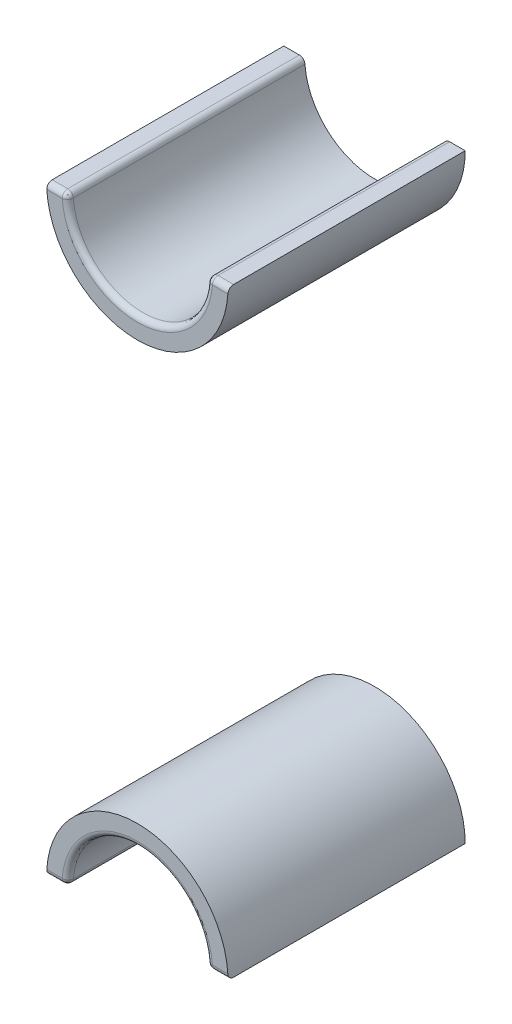
ISO-10303-21;
HEADER;
FILE_DESCRIPTION(('STEP AP214'),'2;1');
FILE_NAME('part.step','',(''),(''),'','','');
FILE_SCHEMA(('AUTOMOTIVE_DESIGN { 1 0 10303 214 1 1 1 1 }'));
ENDSEC;
DATA;
#1=APPLICATION_CONTEXT('core data for automotive mechanical design processes');
#2=APPLICATION_PROTOCOL_DEFINITION('international standard','automotive_design',2000,#1);
#3=PRODUCT_CONTEXT('',#1,'mechanical');
#4=PRODUCT('Part','Part','',(#3));
#5=PRODUCT_RELATED_PRODUCT_CATEGORY('part','',(#4));
#6=PRODUCT_DEFINITION_FORMATION('','',#4);
#7=PRODUCT_DEFINITION_CONTEXT('part definition',#1,'design');
#8=PRODUCT_DEFINITION('design','',#6,#7);
#9=PRODUCT_DEFINITION_SHAPE('','',#8);
#10=(LENGTH_UNIT() NAMED_UNIT(*) SI_UNIT(.MILLI.,.METRE.));
#11=(NAMED_UNIT(*) PLANE_ANGLE_UNIT() SI_UNIT($,.RADIAN.));
#12=(NAMED_UNIT(*) SI_UNIT($,.STERADIAN.) SOLID_ANGLE_UNIT());
#13=UNCERTAINTY_MEASURE_WITH_UNIT(LENGTH_MEASURE(1.E-05),#10,'distance_accuracy_value','');
#14=(GEOMETRIC_REPRESENTATION_CONTEXT(3) GLOBAL_UNCERTAINTY_ASSIGNED_CONTEXT((#13)) GLOBAL_UNIT_ASSIGNED_CONTEXT((#10,
#11,#12)) REPRESENTATION_CONTEXT('',''));
#15=CARTESIAN_POINT('',(0.,0.,0.));
#16=DIRECTION('',(0.,0.,1.));
#17=DIRECTION('',(1.,0.,0.));
#18=AXIS2_PLACEMENT_3D('',#15,#16,#17);
#19=CARTESIAN_POINT('',(-13.76925888777,-7.555000663211,0.83));
#20=DIRECTION('',(0.562053509505717,-0.605350141346696,0.563601861976912));
#21=DIRECTION('',(-0.73282810067942,-0.6804138261783,0.));
#22=AXIS2_PLACEMENT_3D('',#19,#20,#21);
#23=SPHERICAL_SURFACE('',#22,0.02);
#24=CARTESIAN_POINT('',(-13.7580178175799,-7.56710766603793,0.841272037239538));
#25=VERTEX_POINT('',#24);
#26=VERTEX_LOOP('',#25);
#27=FACE_BOUND('',#26,.T.);
#28=CARTESIAN_POINT('',(-13.7692588877685,-7.55500066321122,0.83));
#29=DIRECTION('',(1.,1.19248806385E-08,0.));
#30=DIRECTION('',(-1.19248806385E-08,1.,0.));
#31=AXIS2_PLACEMENT_3D('',#28,#29,#30);
#32=CIRCLE('',#31,0.02);
#33=CARTESIAN_POINT('',(-13.7692588875308,-7.57500066321085,0.83));
#34=VERTEX_POINT('',#33);
#35=CARTESIAN_POINT('',(-13.7692588877715,-7.55500066321087,0.85));
#36=VERTEX_POINT('',#35);
#37=EDGE_CURVE('P0_E95',#34,#36,#32,.F.);
#38=ORIENTED_EDGE('',*,*,#37,.F.);
#39=CARTESIAN_POINT('',(-13.76925888777,-7.555000663211,0.83));
#40=DIRECTION('',(0.,0.,1.));
#41=DIRECTION('',(1.,0.,0.));
#42=AXIS2_PLACEMENT_3D('',#39,#40,#41);
#43=CIRCLE('',#42,0.02);
#44=CARTESIAN_POINT('',(-13.7493138329137,-7.55648214445459,0.83));
#45=VERTEX_POINT('',#44);
#46=EDGE_CURVE('P0_E97',#45,#34,#43,.F.);
#47=ORIENTED_EDGE('',*,*,#46,.F.);
#48=CARTESIAN_POINT('',(-13.7692588877752,-7.55500066321061,0.83));
#49=DIRECTION('',(0.0740740621829114,0.997252742945199,0.));
#50=DIRECTION('',(-0.997252742945202,0.0740740621828693,0.));
#51=AXIS2_PLACEMENT_3D('',#48,#49,#50);
#52=CIRCLE('',#51,0.02);
#53=EDGE_CURVE('P0_E92',#36,#45,#52,.T.);
#54=ORIENTED_EDGE('',*,*,#53,.F.);
#55=EDGE_LOOP('',(#38,#47,#54));
#56=FACE_BOUND('',#55,.T.);
#57=ADVANCED_FACE('P0_F17',(#27,#56),#23,.T.);
#58=CARTESIAN_POINT('',(-13.50000064718,-7.57500066,0.83));
#59=DIRECTION('',(0.,0.,-1.));
#60=DIRECTION('',(-1.19248810928721E-08,1.,0.));
#61=AXIS2_PLACEMENT_3D('',#58,#59,#60);
#62=TOROIDAL_SURFACE('',#61,0.27,0.02);
#63=CARTESIAN_POINT('',(-13.2307424070618,-7.55500065678907,0.83));
#64=DIRECTION('',(0.0740740859664174,-0.997252741178604,0.));
#65=DIRECTION('',(0.997252741178601,0.0740740859664595,0.));
#66=AXIS2_PLACEMENT_3D('',#63,#64,#65);
#67=CIRCLE('',#66,0.02);
#68=CARTESIAN_POINT('',(-13.2307424070603,-7.55500065678911,0.85));
#69=VERTEX_POINT('',#68);
#70=CARTESIAN_POINT('',(-13.2506874618845,-7.55648213850833,0.83));
#71=VERTEX_POINT('',#70);
#72=EDGE_CURVE('P0_E99',#69,#71,#67,.T.);
#73=ORIENTED_EDGE('',*,*,#72,.F.);
#74=CARTESIAN_POINT('',(-13.50000064718,-7.57500066,0.85));
#75=DIRECTION('',(0.,0.,1.));
#76=DIRECTION('',(0.997252741178604,0.0740740859664134,0.));
#77=AXIS2_PLACEMENT_3D('',#74,#75,#76);
#78=CIRCLE('',#77,0.270000000000889);
#79=EDGE_CURVE('P0_E101',#36,#69,#78,.F.);
#80=ORIENTED_EDGE('',*,*,#79,.F.);
#81=ORIENTED_EDGE('',*,*,#53,.T.);
#82=CARTESIAN_POINT('',(-13.50000064718,-7.57500066,0.83));
#83=DIRECTION('',(0.,0.,-1.));
#84=DIRECTION('',(-1.,0.,0.));
#85=AXIS2_PLACEMENT_3D('',#82,#83,#84);
#86=CIRCLE('',#85,0.25);
#87=EDGE_CURVE('P0_E79',#45,#71,#86,.T.);
#88=ORIENTED_EDGE('',*,*,#87,.T.);
#89=EDGE_LOOP('',(#73,#80,#81,#88));
#90=FACE_BOUND('',#89,.T.);
#91=ADVANCED_FACE('P0_F103',(#90),#62,.T.);
#92=CARTESIAN_POINT('',(-13.23074240706,-7.555000656789,0.83));
#93=DIRECTION('',(-0.562053495069257,-0.605350154751276,0.5636018619762));
#94=DIRECTION('',(-0.732828116906504,0.680413808701196,-2.62206922840846E-13));
#95=AXIS2_PLACEMENT_3D('',#92,#93,#94);
#96=SPHERICAL_SURFACE('',#95,0.02);
#97=CARTESIAN_POINT('',(-13.2419834769614,-7.56710765988403,0.841272037239524));
#98=VERTEX_POINT('',#97);
#99=VERTEX_LOOP('',#98);
#100=FACE_BOUND('',#99,.T.);
#101=CARTESIAN_POINT('',(-13.23074240706,-7.55500065678948,0.83));
#102=DIRECTION('',(1.,1.19248806385E-08,0.));
#103=DIRECTION('',(-1.19248806385E-08,1.,0.));
#104=AXIS2_PLACEMENT_3D('',#101,#102,#103);
#105=CIRCLE('',#104,0.02);
#106=CARTESIAN_POINT('',(-13.2307424068208,-7.57500065678904,0.83));
#107=VERTEX_POINT('',#106);
#108=EDGE_CURVE('P0_E124',#69,#107,#105,.T.);
#109=ORIENTED_EDGE('',*,*,#108,.F.);
#110=ORIENTED_EDGE('',*,*,#72,.T.);
#111=CARTESIAN_POINT('',(-13.23074240706,-7.555000656789,0.83));
#112=DIRECTION('',(0.,0.,-1.));
#113=DIRECTION('',(-1.,0.,0.));
#114=AXIS2_PLACEMENT_3D('',#111,#112,#113);
#115=CIRCLE('',#114,0.02);
#116=EDGE_CURVE('P0_E148',#107,#71,#115,.T.);
#117=ORIENTED_EDGE('',*,*,#116,.F.);
#118=EDGE_LOOP('',(#109,#110,#117));
#119=FACE_BOUND('',#118,.T.);
#120=ADVANCED_FACE('P0_F152',(#100,#119),#96,.T.);
#121=CARTESIAN_POINT('',(-13.50000064718,-7.57500066,0.));
#122=DIRECTION('',(0.,0.,-1.));
#123=DIRECTION('',(-1.,0.,0.));
#124=AXIS2_PLACEMENT_3D('',#121,#122,#123);
#125=CYLINDRICAL_SURFACE('',#124,0.25);
#126=CARTESIAN_POINT('',(-13.50000064718,-7.57500066,0.));
#127=DIRECTION('',(0.,0.,-1.));
#128=DIRECTION('',(-1.,0.,0.));
#129=AXIS2_PLACEMENT_3D('',#126,#127,#128);
#130=CIRCLE('',#129,0.25);
#131=CARTESIAN_POINT('',(-13.7493138329113,-7.55648214445477,0.));
#132=VERTEX_POINT('',#131);
#133=CARTESIAN_POINT('',(-13.2506874618836,-7.5564821385083,0.));
#134=VERTEX_POINT('',#133);
#135=EDGE_CURVE('P0_E210',#132,#134,#130,.T.);
#136=ORIENTED_EDGE('',*,*,#135,.T.);
#137=DIRECTION('',(0.,0.,-1.));
#138=VECTOR('',#137,1.);
#139=CARTESIAN_POINT('',(-13.2506874618836,-7.55648213850827,0.));
#140=LINE('',#139,#138);
#141=EDGE_CURVE('P0_E141',#71,#134,#140,.T.);
#142=ORIENTED_EDGE('',*,*,#141,.F.);
#143=ORIENTED_EDGE('',*,*,#87,.F.);
#144=DIRECTION('',(0.,0.,1.));
#145=VECTOR('',#144,1.);
#146=CARTESIAN_POINT('',(-13.7493138329111,-7.55648214445492,0.));
#147=LINE('',#146,#145);
#148=EDGE_CURVE('P0_E139',#132,#45,#147,.T.);
#149=ORIENTED_EDGE('',*,*,#148,.F.);
#150=EDGE_LOOP('',(#136,#142,#143,#149));
#151=FACE_BOUND('',#150,.T.);
#152=ADVANCED_FACE('P0_F155',(#151),#125,.F.);
#153=CARTESIAN_POINT('',(-13.23074240706,-7.555000656789,0.));
#154=DIRECTION('',(0.,0.,-1.));
#155=DIRECTION('',(-1.,0.,0.));
#156=AXIS2_PLACEMENT_3D('',#153,#154,#155);
#157=CYLINDRICAL_SURFACE('',#156,0.02);
#158=ORIENTED_EDGE('',*,*,#116,.T.);
#159=ORIENTED_EDGE('',*,*,#141,.T.);
#160=CARTESIAN_POINT('',(-13.23074240706,-7.555000656789,0.));
#161=DIRECTION('',(0.,0.,-1.));
#162=DIRECTION('',(-1.,0.,0.));
#163=AXIS2_PLACEMENT_3D('',#160,#161,#162);
#164=CIRCLE('',#163,0.02);
#165=CARTESIAN_POINT('',(-13.23074240694,-7.57500065678892,0.));
#166=VERTEX_POINT('',#165);
#167=EDGE_CURVE('P0_E208',#134,#166,#164,.F.);
#168=ORIENTED_EDGE('',*,*,#167,.T.);
#169=DIRECTION('',(0.,0.,1.));
#170=VECTOR('',#169,1.);
#171=CARTESIAN_POINT('',(-13.23074240682,-7.57500065678883,0.));
#172=LINE('',#171,#170);
#173=EDGE_CURVE('P0_E142',#107,#166,#172,.F.);
#174=ORIENTED_EDGE('',*,*,#173,.F.);
#175=EDGE_LOOP('',(#158,#159,#168,#174));
#176=FACE_BOUND('',#175,.T.);
#177=ADVANCED_FACE('P0_F228',(#176),#157,.T.);
#178=CARTESIAN_POINT('',(-13.76925888777,-7.555000663211,0.));
#179=DIRECTION('',(0.,0.,1.));
#180=DIRECTION('',(1.,0.,0.));
#181=AXIS2_PLACEMENT_3D('',#178,#179,#180);
#182=CYLINDRICAL_SURFACE('',#181,0.02);
#183=ORIENTED_EDGE('',*,*,#46,.T.);
#184=DIRECTION('',(0.,0.,1.));
#185=VECTOR('',#184,1.);
#186=CARTESIAN_POINT('',(-13.76925888753,-7.57500066321058,0.));
#187=LINE('',#186,#185);
#188=CARTESIAN_POINT('',(-13.7692588875308,-7.57500066321058,0.));
#189=VERTEX_POINT('',#188);
#190=EDGE_CURVE('P0_E136',#189,#34,#187,.T.);
#191=ORIENTED_EDGE('',*,*,#190,.F.);
#192=CARTESIAN_POINT('',(-13.76925888777,-7.555000663211,0.));
#193=DIRECTION('',(0.,0.,1.));
#194=DIRECTION('',(1.,0.,0.));
#195=AXIS2_PLACEMENT_3D('',#192,#193,#194);
#196=CIRCLE('',#195,0.02);
#197=EDGE_CURVE('P0_E138',#189,#132,#196,.T.);
#198=ORIENTED_EDGE('',*,*,#197,.T.);
#199=ORIENTED_EDGE('',*,*,#148,.T.);
#200=EDGE_LOOP('',(#183,#191,#198,#199));
#201=FACE_BOUND('',#200,.T.);
#202=ADVANCED_FACE('P0_F198',(#201),#182,.T.);
#203=CARTESIAN_POINT('',(-13.83750064741,-7.555000664025,0.83));
#204=DIRECTION('',(1.,1.19248806385E-08,0.));
#205=DIRECTION('',(-1.19248806385E-08,1.,0.));
#206=AXIS2_PLACEMENT_3D('',#203,#204,#205);
#207=CYLINDRICAL_SURFACE('',#206,0.02);
#208=CARTESIAN_POINT('',(-13.82500064718,-7.57500066387594,0.83));
#209=CARTESIAN_POINT('',(-13.8250004808292,-7.5750016194319,0.831125123568883));
#210=CARTESIAN_POINT('',(-13.8250006444751,-7.5749057782729,0.832249962108246));
#211=CARTESIAN_POINT('',(-13.8250004018228,-7.57452755234195,0.834466969268648));
#212=CARTESIAN_POINT('',(-13.8249999959676,-7.57424531266217,0.835559162610008));
#213=CARTESIAN_POINT('',(-13.8249973873101,-7.57350113994162,0.837681137901407));
#214=CARTESIAN_POINT('',(-13.824995183641,-7.57303912026681,0.838710889484498));
#215=CARTESIAN_POINT('',(-13.8249867773249,-7.57194891115167,0.840678039491127));
#216=CARTESIAN_POINT('',(-13.8249805753798,-7.57132075088535,0.841615454089265));
#217=CARTESIAN_POINT('',(-13.8249616275743,-7.56991613096735,0.843371345719719));
#218=CARTESIAN_POINT('',(-13.8249488828148,-7.56913969627642,0.844189842730021));
#219=CARTESIAN_POINT('',(-13.824914248728,-7.5674604083711,0.845684980575274));
#220=CARTESIAN_POINT('',(-13.8248923577583,-7.56655753247037,0.846361595898993));
#221=CARTESIAN_POINT('',(-13.8248372356528,-7.56465183605786,0.847553282999996));
#222=CARTESIAN_POINT('',(-13.8248040098989,-7.5636490631371,0.848068431219924));
#223=CARTESIAN_POINT('',(-13.824724756263,-7.56157195457825,0.848922933163592));
#224=CARTESIAN_POINT('',(-13.824678735565,-7.56049765935361,0.849262385228207));
#225=CARTESIAN_POINT('',(-13.8245914482255,-7.55868083945056,0.849672475749821));
#226=CARTESIAN_POINT('',(-13.8245538700387,-7.55794947368611,0.849795248345736));
#227=CARTESIAN_POINT('',(-13.8244732889404,-7.55647900497493,0.84995900090865));
#228=CARTESIAN_POINT('',(-13.8244302938959,-7.55573991464612,0.850000098069969));
#229=CARTESIAN_POINT('',(-13.8243846790846,-7.55500066386773,0.850000000000089));
#230=B_SPLINE_CURVE_WITH_KNOTS('',3,(#208,#209,#210,#211,#212,#213,#214,#215,#216,#217,#218,
#219,#220,#221,#222,#223,#224,#225,#226,#227,#228,#229),.UNSPECIFIED.,.F.,.F.,(4,2,2,2,2,2,2,2,
2,2,4),(0.,0.00337088779653064,0.00673915478967328,0.0101090469282458,0.0134783477116508,
0.0168470818011399,0.0202164210920885,0.0235841628341191,0.0269500175354818,0.0291734060153885,
0.0313936018930567),.UNSPECIFIED.);
#231=CARTESIAN_POINT('',(-13.82500064718,-7.57500066387579,0.83));
#232=VERTEX_POINT('',#231);
#233=CARTESIAN_POINT('',(-13.8243846790847,-7.5550006638683,0.85));
#234=VERTEX_POINT('',#233);
#235=EDGE_CURVE('P0_E199',#232,#234,#230,.T.);
#236=ORIENTED_EDGE('',*,*,#235,.F.);
#237=DIRECTION('',(1.,1.19248806385E-08,0.));
#238=VECTOR('',#237,1.);
#239=CARTESIAN_POINT('',(-14.17500064718,-7.575000668049,0.83));
#240=LINE('',#239,#238);
#241=EDGE_CURVE('P0_E117',#34,#232,#240,.F.);
#242=ORIENTED_EDGE('',*,*,#241,.F.);
#243=ORIENTED_EDGE('',*,*,#37,.T.);
#244=DIRECTION('',(1.,0.,0.));
#245=VECTOR('',#244,1.);
#246=CARTESIAN_POINT('',(-13.50000066,-7.555000663868,0.85));
#247=LINE('',#246,#245);
#248=EDGE_CURVE('P0_E109',#234,#36,#247,.T.);
#249=ORIENTED_EDGE('',*,*,#248,.F.);
#250=EDGE_LOOP('',(#236,#242,#243,#249));
#251=FACE_BOUND('',#250,.T.);
#252=ADVANCED_FACE('P0_F114',(#251),#207,.T.);
#253=CARTESIAN_POINT('',(-13.50000066,-6.50000066,0.85));
#254=DIRECTION('',(0.,0.,1.));
#255=DIRECTION('',(1.,0.,0.));
#256=AXIS2_PLACEMENT_3D('',#253,#254,#255);
#257=PLANE('',#256);
#258=CARTESIAN_POINT('',(-13.50000064718,-7.57500066,0.85));
#259=DIRECTION('',(0.,0.,1.));
#260=DIRECTION('',(1.,0.,0.));
#261=AXIS2_PLACEMENT_3D('',#258,#259,#260);
#262=CIRCLE('',#261,0.325);
#263=CARTESIAN_POINT('',(-13.1756166157523,-7.55500065613207,0.85));
#264=VERTEX_POINT('',#263);
#265=EDGE_CURVE('P0_E122',#234,#264,#262,.F.);
#266=ORIENTED_EDGE('',*,*,#265,.F.);
#267=ORIENTED_EDGE('',*,*,#248,.T.);
#268=ORIENTED_EDGE('',*,*,#79,.T.);
#269=DIRECTION('',(1.,1.19248806385E-08,0.));
#270=VECTOR('',#269,1.);
#271=CARTESIAN_POINT('',(-13.83750064741,-7.55500066402489,0.85));
#272=LINE('',#271,#270);
#273=EDGE_CURVE('P0_E127',#264,#69,#272,.F.);
#274=ORIENTED_EDGE('',*,*,#273,.F.);
#275=EDGE_LOOP('',(#266,#267,#268,#274));
#276=FACE_BOUND('',#275,.T.);
#277=ADVANCED_FACE('P0_F120',(#276),#257,.T.);
#278=CARTESIAN_POINT('',(-13.83750064741,-7.555000664025,0.83));
#279=DIRECTION('',(1.,1.19248806385E-08,0.));
#280=DIRECTION('',(-1.19248806385E-08,1.,0.));
#281=AXIS2_PLACEMENT_3D('',#278,#279,#280);
#282=CYLINDRICAL_SURFACE('',#281,0.02);
#283=CARTESIAN_POINT('',(-13.1756166157523,-7.55500065613214,0.85));
#284=CARTESIAN_POINT('',(-13.1755471635144,-7.55612345906747,0.850000969472047));
#285=CARTESIAN_POINT('',(-13.1754839986719,-7.55724640918026,0.849905503726735));
#286=CARTESIAN_POINT('',(-13.1753705645926,-7.55946044321903,0.849528437846931));
#287=CARTESIAN_POINT('',(-13.1753202856526,-7.56055155057112,0.849246978343128));
#288=CARTESIAN_POINT('',(-13.1752328148194,-7.56267210208367,0.84850444179715));
#289=CARTESIAN_POINT('',(-13.1751956300154,-7.56370151259154,0.848043267739998));
#290=CARTESIAN_POINT('',(-13.1751331727483,-7.56566843151144,0.846954676494005));
#291=CARTESIAN_POINT('',(-13.1751078979592,-7.56660595783952,0.846327291802449));
#292=CARTESIAN_POINT('',(-13.1750672753098,-7.56836165506623,0.844924649535387));
#293=CARTESIAN_POINT('',(-13.1750519175351,-7.56917994453489,0.844149540653264));
#294=CARTESIAN_POINT('',(-13.1750285705575,-7.5706751652662,0.842472832865467));
#295=CARTESIAN_POINT('',(-13.1750205828515,-7.57135206779302,0.841571208308567));
#296=CARTESIAN_POINT('',(-13.1750093710271,-7.57254543605215,0.839666687099441));
#297=CARTESIAN_POINT('',(-13.1750061498951,-7.57306180104669,0.838663727379951));
#298=CARTESIAN_POINT('',(-13.1750021640994,-7.5739186754721,0.836585581185424));
#299=CARTESIAN_POINT('',(-13.1750013980185,-7.57425928627016,0.835510436748642));
#300=CARTESIAN_POINT('',(-13.1750007728669,-7.57467122416491,0.833690713993594));
#301=CARTESIAN_POINT('',(-13.1750006944751,-7.57479468355434,0.832957510883386));
#302=CARTESIAN_POINT('',(-13.1750006468751,-7.57495939079951,0.83148297378818));
#303=CARTESIAN_POINT('',(-13.1750006775137,-7.5750007539069,0.830741652672947));
#304=CARTESIAN_POINT('',(-13.1750006471799,-7.57500065612487,0.830000000000023));
#305=B_SPLINE_CURVE_WITH_KNOTS('',3,(#283,#284,#285,#286,#287,#288,#289,#290,#291,#292,#293,
#294,#295,#296,#297,#298,#299,#300,#301,#302,#303,#304),.UNSPECIFIED.,.F.,.F.,(4,2,2,2,2,2,2,2,
2,2,4),(0.,0.00337044104955288,0.00673833660537151,0.0101080527702394,0.0134771105782273,
0.0168427949656206,0.0202091627387483,0.0235776386735302,0.0269441696435772,0.0291704577066195,
0.0313936181572664),.UNSPECIFIED.);
#306=CARTESIAN_POINT('',(-13.17500064718,-7.57500065806206,0.83));
#307=VERTEX_POINT('',#306);
#308=EDGE_CURVE('P0_E172',#264,#307,#305,.T.);
#309=ORIENTED_EDGE('',*,*,#308,.F.);
#310=ORIENTED_EDGE('',*,*,#273,.T.);
#311=ORIENTED_EDGE('',*,*,#108,.T.);
#312=DIRECTION('',(1.,1.19248806385E-08,0.));
#313=VECTOR('',#312,1.);
#314=CARTESIAN_POINT('',(-14.17500064718,-7.575000668049,0.83));
#315=LINE('',#314,#313);
#316=EDGE_CURVE('P0_E145',#307,#107,#315,.F.);
#317=ORIENTED_EDGE('',*,*,#316,.F.);
#318=EDGE_LOOP('',(#309,#310,#311,#317));
#319=FACE_BOUND('',#318,.T.);
#320=ADVANCED_FACE('P0_F185',(#319),#282,.T.);
#321=CARTESIAN_POINT('',(-14.17500064718,-7.575000668049,0.));
#322=DIRECTION('',(1.19248806385E-08,-1.,0.));
#323=DIRECTION('',(1.,1.19248806385E-08,0.));
#324=AXIS2_PLACEMENT_3D('',#321,#322,#323);
#325=PLANE('',#324);
#326=DIRECTION('',(0.,0.,1.));
#327=VECTOR('',#326,1.);
#328=CARTESIAN_POINT('',(-13.17500064718,-7.57500066,0.85));
#329=LINE('',#328,#327);
#330=CARTESIAN_POINT('',(-13.17500064718,-7.5750006583945,0.));
#331=VERTEX_POINT('',#330);
#332=EDGE_CURVE('P0_E171',#307,#331,#329,.F.);
#333=ORIENTED_EDGE('',*,*,#332,.F.);
#334=ORIENTED_EDGE('',*,*,#316,.T.);
#335=ORIENTED_EDGE('',*,*,#173,.T.);
#336=DIRECTION('',(1.,0.,0.));
#337=VECTOR('',#336,1.);
#338=CARTESIAN_POINT('',(-13.50000066,-7.575000656789,0.));
#339=LINE('',#338,#337);
#340=EDGE_CURVE('P0_E207',#166,#331,#339,.T.);
#341=ORIENTED_EDGE('',*,*,#340,.T.);
#342=EDGE_LOOP('',(#333,#334,#335,#341));
#343=FACE_BOUND('',#342,.T.);
#344=ADVANCED_FACE('P0_F189',(#343),#325,.T.);
#345=CARTESIAN_POINT('',(-13.50000066,-6.50000066,0.));
#346=DIRECTION('',(0.,0.,1.));
#347=DIRECTION('',(1.,0.,0.));
#348=AXIS2_PLACEMENT_3D('',#345,#346,#347);
#349=PLANE('',#348);
#350=DIRECTION('',(1.,1.19248806385E-08,0.));
#351=VECTOR('',#350,1.);
#352=CARTESIAN_POINT('',(-14.17500064718,-7.575000668049,0.));
#353=LINE('',#352,#351);
#354=CARTESIAN_POINT('',(-13.82500064718,-7.57500066387565,0.));
#355=VERTEX_POINT('',#354);
#356=EDGE_CURVE('P0_E36',#355,#189,#353,.T.);
#357=ORIENTED_EDGE('',*,*,#356,.F.);
#358=CARTESIAN_POINT('',(-13.50000064718,-7.57500066,0.));
#359=DIRECTION('',(0.,0.,1.));
#360=DIRECTION('',(1.,0.,0.));
#361=AXIS2_PLACEMENT_3D('',#358,#359,#360);
#362=CIRCLE('',#361,0.325);
#363=EDGE_CURVE('P0_E27',#331,#355,#362,.T.);
#364=ORIENTED_EDGE('',*,*,#363,.F.);
#365=ORIENTED_EDGE('',*,*,#340,.F.);
#366=ORIENTED_EDGE('',*,*,#167,.F.);
#367=ORIENTED_EDGE('',*,*,#135,.F.);
#368=ORIENTED_EDGE('',*,*,#197,.F.);
#369=EDGE_LOOP('',(#357,#364,#365,#366,#367,#368));
#370=FACE_BOUND('',#369,.T.);
#371=ADVANCED_FACE('P0_F247',(#370),#349,.F.);
#372=CARTESIAN_POINT('',(-14.17500064718,-7.575000668049,0.));
#373=DIRECTION('',(1.19248806385E-08,-1.,0.));
#374=DIRECTION('',(1.,1.19248806385E-08,0.));
#375=AXIS2_PLACEMENT_3D('',#372,#373,#374);
#376=PLANE('',#375);
#377=DIRECTION('',(0.,0.,1.));
#378=VECTOR('',#377,1.);
#379=CARTESIAN_POINT('',(-13.82500064718,-7.575000663876,0.85));
#380=LINE('',#379,#378);
#381=EDGE_CURVE('P0_E11',#355,#232,#380,.T.);
#382=ORIENTED_EDGE('',*,*,#381,.F.);
#383=ORIENTED_EDGE('',*,*,#356,.T.);
#384=ORIENTED_EDGE('',*,*,#190,.T.);
#385=ORIENTED_EDGE('',*,*,#241,.T.);
#386=EDGE_LOOP('',(#382,#383,#384,#385));
#387=FACE_BOUND('',#386,.T.);
#388=ADVANCED_FACE('P0_F245',(#387),#376,.T.);
#389=CARTESIAN_POINT('',(-13.50000064718,-7.57500066,0.85));
#390=DIRECTION('',(0.,0.,1.));
#391=DIRECTION('',(1.,0.,0.));
#392=AXIS2_PLACEMENT_3D('',#389,#390,#391);
#393=CYLINDRICAL_SURFACE('',#392,0.325);
#394=ORIENTED_EDGE('',*,*,#363,.T.);
#395=ORIENTED_EDGE('',*,*,#381,.T.);
#396=ORIENTED_EDGE('',*,*,#235,.T.);
#397=ORIENTED_EDGE('',*,*,#265,.T.);
#398=ORIENTED_EDGE('',*,*,#308,.T.);
#399=ORIENTED_EDGE('',*,*,#332,.T.);
#400=EDGE_LOOP('',(#394,#395,#396,#397,#398,#399));
#401=FACE_BOUND('',#400,.T.);
#402=ADVANCED_FACE('P0_F182',(#401),#393,.T.);
#403=CLOSED_SHELL('',(#57,#91,#120,#152,#177,#202,#252,#277,#320,#344,#371,#388,#402));
#404=MANIFOLD_SOLID_BREP('P0_B1',#403);
#405=CARTESIAN_POINT('',(-13.76925891293,-5.445000663211,0.83));
#406=DIRECTION('',(0.562053495069257,0.605350154751276,0.5636018619762));
#407=DIRECTION('',(0.732828116906504,-0.680413808701196,-2.62206922840846E-13));
#408=AXIS2_PLACEMENT_3D('',#405,#406,#407);
#409=SPHERICAL_SURFACE('',#408,0.02);
#410=CARTESIAN_POINT('',(-13.7580178430286,-5.43289366011597,0.841272037239524));
#411=VERTEX_POINT('',#410);
#412=VERTEX_LOOP('',#411);
#413=FACE_BOUND('',#412,.T.);
#414=CARTESIAN_POINT('',(-13.76925891293,-5.44500066321052,0.83));
#415=DIRECTION('',(-1.,-1.19248806385E-08,0.));
#416=DIRECTION('',(1.19248806385E-08,-1.,0.));
#417=AXIS2_PLACEMENT_3D('',#414,#415,#416);
#418=CIRCLE('',#417,0.02);
#419=CARTESIAN_POINT('',(-13.7692589129297,-5.44500066321095,0.85));
#420=VERTEX_POINT('',#419);
#421=CARTESIAN_POINT('',(-13.7692589131692,-5.42500066321096,0.83));
#422=VERTEX_POINT('',#421);
#423=EDGE_CURVE('P1_E82',#420,#422,#418,.T.);
#424=ORIENTED_EDGE('',*,*,#423,.F.);
#425=CARTESIAN_POINT('',(-13.7692589129282,-5.44500066321093,0.83));
#426=DIRECTION('',(-0.0740740859664217,0.997252741178604,0.));
#427=DIRECTION('',(-0.997252741178601,-0.0740740859664638,0.));
#428=AXIS2_PLACEMENT_3D('',#425,#426,#427);
#429=CIRCLE('',#428,0.02);
#430=CARTESIAN_POINT('',(-13.7493138581055,-5.44351918149167,0.83));
#431=VERTEX_POINT('',#430);
#432=EDGE_CURVE('P1_E84',#431,#420,#429,.F.);
#433=ORIENTED_EDGE('',*,*,#432,.F.);
#434=CARTESIAN_POINT('',(-13.76925891293,-5.445000663211,0.83));
#435=DIRECTION('',(0.,0.,-1.));
#436=DIRECTION('',(-1.,0.,0.));
#437=AXIS2_PLACEMENT_3D('',#434,#435,#436);
#438=CIRCLE('',#437,0.02);
#439=EDGE_CURVE('P1_E21',#422,#431,#438,.T.);
#440=ORIENTED_EDGE('',*,*,#439,.F.);
#441=EDGE_LOOP('',(#424,#433,#440));
#442=FACE_BOUND('',#441,.T.);
#443=ADVANCED_FACE('P1_F17',(#413,#442),#409,.T.);
#444=CARTESIAN_POINT('',(-13.50000067281,-5.42500066,0.));
#445=DIRECTION('',(0.,0.,-1.));
#446=DIRECTION('',(-1.,0.,0.));
#447=AXIS2_PLACEMENT_3D('',#444,#445,#446);
#448=CYLINDRICAL_SURFACE('',#447,0.25);
#449=CARTESIAN_POINT('',(-13.50000067281,-5.42500066,0.));
#450=DIRECTION('',(0.,0.,-1.));
#451=DIRECTION('',(-1.,0.,0.));
#452=AXIS2_PLACEMENT_3D('',#449,#450,#451);
#453=CIRCLE('',#452,0.25);
#454=CARTESIAN_POINT('',(-13.2506874870787,-5.44351917554523,0.));
#455=VERTEX_POINT('',#454);
#456=CARTESIAN_POINT('',(-13.7493138581064,-5.4435191814917,0.));
#457=VERTEX_POINT('',#456);
#458=EDGE_CURVE('P1_E110',#455,#457,#453,.T.);
#459=ORIENTED_EDGE('',*,*,#458,.T.);
#460=DIRECTION('',(0.,0.,-1.));
#461=VECTOR('',#460,1.);
#462=CARTESIAN_POINT('',(-13.7493138581064,-5.44351918149173,0.));
#463=LINE('',#462,#461);
#464=EDGE_CURVE('P1_E87',#431,#457,#463,.T.);
#465=ORIENTED_EDGE('',*,*,#464,.F.);
#466=CARTESIAN_POINT('',(-13.50000067281,-5.42500066,0.83));
#467=DIRECTION('',(0.,0.,-1.));
#468=DIRECTION('',(-1.19248777519232E-08,1.,0.));
#469=AXIS2_PLACEMENT_3D('',#466,#467,#468);
#470=CIRCLE('',#469,0.25);
#471=CARTESIAN_POINT('',(-13.2506874870763,-5.44351917554541,0.83));
#472=VERTEX_POINT('',#471);
#473=EDGE_CURVE('P1_E152',#472,#431,#470,.T.);
#474=ORIENTED_EDGE('',*,*,#473,.F.);
#475=DIRECTION('',(0.,0.,1.));
#476=VECTOR('',#475,1.);
#477=CARTESIAN_POINT('',(-13.2506874870789,-5.44351917554508,0.));
#478=LINE('',#477,#476);
#479=EDGE_CURVE('P1_E147',#455,#472,#478,.T.);
#480=ORIENTED_EDGE('',*,*,#479,.F.);
#481=EDGE_LOOP('',(#459,#465,#474,#480));
#482=FACE_BOUND('',#481,.T.);
#483=ADVANCED_FACE('P1_F232',(#482),#448,.F.);
#484=CARTESIAN_POINT('',(-13.76925891293,-5.445000663211,0.));
#485=DIRECTION('',(0.,0.,-1.));
#486=DIRECTION('',(-1.,0.,0.));
#487=AXIS2_PLACEMENT_3D('',#484,#485,#486);
#488=CYLINDRICAL_SURFACE('',#487,0.02);
#489=ORIENTED_EDGE('',*,*,#439,.T.);
#490=ORIENTED_EDGE('',*,*,#464,.T.);
#491=CARTESIAN_POINT('',(-13.76925891293,-5.445000663211,0.));
#492=DIRECTION('',(0.,0.,-1.));
#493=DIRECTION('',(-1.,0.,0.));
#494=AXIS2_PLACEMENT_3D('',#491,#492,#493);
#495=CIRCLE('',#494,0.02);
#496=CARTESIAN_POINT('',(-13.76925891305,-5.42500066321108,0.));
#497=VERTEX_POINT('',#496);
#498=EDGE_CURVE('P1_E92',#457,#497,#495,.F.);
#499=ORIENTED_EDGE('',*,*,#498,.T.);
#500=DIRECTION('',(0.,0.,1.));
#501=VECTOR('',#500,1.);
#502=CARTESIAN_POINT('',(-13.76925891317,-5.42500066321117,0.));
#503=LINE('',#502,#501);
#504=EDGE_CURVE('P1_E89',#422,#497,#503,.F.);
#505=ORIENTED_EDGE('',*,*,#504,.F.);
#506=EDGE_LOOP('',(#489,#490,#499,#505));
#507=FACE_BOUND('',#506,.T.);
#508=ADVANCED_FACE('P1_F90',(#507),#488,.T.);
#509=CARTESIAN_POINT('',(-13.23074243222,-5.445000656789,0.));
#510=DIRECTION('',(0.,0.,1.));
#511=DIRECTION('',(1.,0.,0.));
#512=AXIS2_PLACEMENT_3D('',#509,#510,#511);
#513=CYLINDRICAL_SURFACE('',#512,0.02);
#514=CARTESIAN_POINT('',(-13.23074243222,-5.445000656789,0.83));
#515=DIRECTION('',(0.,0.,1.));
#516=DIRECTION('',(1.,0.,0.));
#517=AXIS2_PLACEMENT_3D('',#514,#515,#516);
#518=CIRCLE('',#517,0.02);
#519=CARTESIAN_POINT('',(-13.2307424324592,-5.4250006567891,0.83));
#520=VERTEX_POINT('',#519);
#521=EDGE_CURVE('P1_E148',#520,#472,#518,.T.);
#522=ORIENTED_EDGE('',*,*,#521,.F.);
#523=DIRECTION('',(0.,0.,1.));
#524=VECTOR('',#523,1.);
#525=CARTESIAN_POINT('',(-13.23074243246,-5.42500065678942,0.));
#526=LINE('',#525,#524);
#527=CARTESIAN_POINT('',(-13.2307424324592,-5.42500065678942,0.));
#528=VERTEX_POINT('',#527);
#529=EDGE_CURVE('P1_E136',#528,#520,#526,.T.);
#530=ORIENTED_EDGE('',*,*,#529,.F.);
#531=CARTESIAN_POINT('',(-13.23074243222,-5.445000656789,0.));
#532=DIRECTION('',(0.,0.,1.));
#533=DIRECTION('',(1.,0.,0.));
#534=AXIS2_PLACEMENT_3D('',#531,#532,#533);
#535=CIRCLE('',#534,0.02);
#536=EDGE_CURVE('P1_E144',#528,#455,#535,.T.);
#537=ORIENTED_EDGE('',*,*,#536,.T.);
#538=ORIENTED_EDGE('',*,*,#479,.T.);
#539=EDGE_LOOP('',(#522,#530,#537,#538));
#540=FACE_BOUND('',#539,.T.);
#541=ADVANCED_FACE('P1_F260',(#540),#513,.T.);
#542=CARTESIAN_POINT('',(-13.23074243222,-5.445000656789,0.83));
#543=DIRECTION('',(-0.562053509505717,0.605350141346696,0.563601861976912));
#544=DIRECTION('',(0.73282810067942,0.6804138261783,0.));
#545=AXIS2_PLACEMENT_3D('',#542,#543,#544);
#546=SPHERICAL_SURFACE('',#545,0.02);
#547=CARTESIAN_POINT('',(-13.2419835024101,-5.43289365396207,0.841272037239538));
#548=VERTEX_POINT('',#547);
#549=VERTEX_LOOP('',#548);
#550=FACE_BOUND('',#549,.T.);
#551=CARTESIAN_POINT('',(-13.2307424322215,-5.44500065678878,0.83));
#552=DIRECTION('',(-1.,-1.19248806385E-08,0.));
#553=DIRECTION('',(1.19248806385E-08,-1.,0.));
#554=AXIS2_PLACEMENT_3D('',#551,#552,#553);
#555=CIRCLE('',#554,0.02);
#556=CARTESIAN_POINT('',(-13.2307424322185,-5.44500065678913,0.85));
#557=VERTEX_POINT('',#556);
#558=EDGE_CURVE('P1_E200',#520,#557,#555,.F.);
#559=ORIENTED_EDGE('',*,*,#558,.F.);
#560=ORIENTED_EDGE('',*,*,#521,.T.);
#561=CARTESIAN_POINT('',(-13.2307424322148,-5.44500065678938,0.83));
#562=DIRECTION('',(-0.0740740621829088,-0.997252742945199,0.));
#563=DIRECTION('',(0.997252742945202,-0.0740740621828667,0.));
#564=AXIS2_PLACEMENT_3D('',#561,#562,#563);
#565=CIRCLE('',#564,0.02);
#566=EDGE_CURVE('P1_E154',#557,#472,#565,.T.);
#567=ORIENTED_EDGE('',*,*,#566,.F.);
#568=EDGE_LOOP('',(#559,#560,#567));
#569=FACE_BOUND('',#568,.T.);
#570=ADVANCED_FACE('P1_F127',(#550,#569),#546,.T.);
#571=CARTESIAN_POINT('',(-13.50000067281,-5.42500066,0.83));
#572=DIRECTION('',(0.,0.,-1.));
#573=DIRECTION('',(-1.19248810928721E-08,1.,0.));
#574=AXIS2_PLACEMENT_3D('',#571,#572,#573);
#575=TOROIDAL_SURFACE('',#574,0.27,0.02);
#576=ORIENTED_EDGE('',*,*,#432,.T.);
#577=CARTESIAN_POINT('',(-13.50000067281,-5.42500066,0.85));
#578=DIRECTION('',(0.,0.,1.));
#579=DIRECTION('',(-0.997252741178604,-0.0740740859664171,0.));
#580=AXIS2_PLACEMENT_3D('',#577,#578,#579);
#581=CIRCLE('',#580,0.270000000000888);
#582=EDGE_CURVE('P1_E201',#557,#420,#581,.F.);
#583=ORIENTED_EDGE('',*,*,#582,.F.);
#584=ORIENTED_EDGE('',*,*,#566,.T.);
#585=ORIENTED_EDGE('',*,*,#473,.T.);
#586=EDGE_LOOP('',(#576,#583,#584,#585));
#587=FACE_BOUND('',#586,.T.);
#588=ADVANCED_FACE('P1_F122',(#587),#575,.T.);
#589=CARTESIAN_POINT('',(-13.16250067258,-5.445000655975,0.83));
#590=DIRECTION('',(-1.,-1.19248806385E-08,0.));
#591=DIRECTION('',(1.19248806385E-08,-1.,0.));
#592=AXIS2_PLACEMENT_3D('',#589,#590,#591);
#593=CYLINDRICAL_SURFACE('',#592,0.02);
#594=CARTESIAN_POINT('',(-13.8243847042377,-5.44500066386786,0.85));
#595=CARTESIAN_POINT('',(-13.8244541564756,-5.44387786093253,0.850000969472047));
#596=CARTESIAN_POINT('',(-13.8245173213181,-5.44275491081974,0.849905503726736));
#597=CARTESIAN_POINT('',(-13.8246307553974,-5.44054087678097,0.849528437846931));
#598=CARTESIAN_POINT('',(-13.8246810343374,-5.43944976942888,0.849246978343128));
#599=CARTESIAN_POINT('',(-13.8247685051706,-5.43732921791633,0.84850444179715));
#600=CARTESIAN_POINT('',(-13.8248056899746,-5.43629980740847,0.848043267739999));
#601=CARTESIAN_POINT('',(-13.8248681472417,-5.43433288848856,0.846954676494006));
#602=CARTESIAN_POINT('',(-13.8248934220308,-5.43339536216048,0.84632729180245));
#603=CARTESIAN_POINT('',(-13.8249340446802,-5.43163966493377,0.844924649535388));
#604=CARTESIAN_POINT('',(-13.8249494024549,-5.43082137546511,0.844149540653265));
#605=CARTESIAN_POINT('',(-13.8249727494325,-5.4293261547338,0.842472832865468));
#606=CARTESIAN_POINT('',(-13.8249807371385,-5.42864925220698,0.841571208308569));
#607=CARTESIAN_POINT('',(-13.8249919489629,-5.42745588394785,0.839666687099443));
#608=CARTESIAN_POINT('',(-13.8249951700949,-5.42693951895331,0.838663727379952));
#609=CARTESIAN_POINT('',(-13.8249991558906,-5.4260826445279,0.836585581185425));
#610=CARTESIAN_POINT('',(-13.8249999219715,-5.42574203372984,0.835510436748643));
#611=CARTESIAN_POINT('',(-13.8250005471231,-5.42533009583509,0.833690713993595));
#612=CARTESIAN_POINT('',(-13.8250006255149,-5.42520663644566,0.832957510883387));
#613=CARTESIAN_POINT('',(-13.8250006731149,-5.42504192920049,0.831482973788181));
#614=CARTESIAN_POINT('',(-13.8250006424763,-5.4250005660931,0.830741652672947));
#615=CARTESIAN_POINT('',(-13.8250006728101,-5.42500066387513,0.830000000000023));
#616=B_SPLINE_CURVE_WITH_KNOTS('',3,(#594,#595,#596,#597,#598,#599,#600,#601,#602,#603,#604,
#605,#606,#607,#608,#609,#610,#611,#612,#613,#614,#615),.UNSPECIFIED.,.F.,.F.,(4,2,2,2,2,2,2,2,
2,2,4),(0.,0.00337044104955286,0.00673833660537147,0.0101080527702383,0.013477110578227,
0.0168427949656202,0.0202091627387477,0.0235776386735302,0.0269441696435764,0.0291704577066196,
0.0313936181572673),.UNSPECIFIED.);
#617=CARTESIAN_POINT('',(-13.8243847042579,-5.44500066353943,0.85));
#618=VERTEX_POINT('',#617);
#619=CARTESIAN_POINT('',(-13.82500067281,-5.42500066387594,0.83));
#620=VERTEX_POINT('',#619);
#621=EDGE_CURVE('P1_E247',#618,#620,#616,.T.);
#622=ORIENTED_EDGE('',*,*,#621,.F.);
#623=DIRECTION('',(1.,0.,0.));
#624=VECTOR('',#623,1.);
#625=CARTESIAN_POINT('',(-13.50000066,-5.445000663211,0.85));
#626=LINE('',#625,#624);
#627=EDGE_CURVE('P1_E103',#420,#618,#626,.F.);
#628=ORIENTED_EDGE('',*,*,#627,.F.);
#629=ORIENTED_EDGE('',*,*,#423,.T.);
#630=DIRECTION('',(-1.,-1.19248806385E-08,0.));
#631=VECTOR('',#630,1.);
#632=CARTESIAN_POINT('',(-12.82500067281,-5.425000651951,0.83));
#633=LINE('',#632,#631);
#634=EDGE_CURVE('P1_E96',#620,#422,#633,.F.);
#635=ORIENTED_EDGE('',*,*,#634,.F.);
#636=EDGE_LOOP('',(#622,#628,#629,#635));
#637=FACE_BOUND('',#636,.T.);
#638=ADVANCED_FACE('P1_F100',(#637),#593,.T.);
#639=CARTESIAN_POINT('',(-12.82500067281,-5.425000651951,0.));
#640=DIRECTION('',(-1.19248806385E-08,1.,0.));
#641=DIRECTION('',(-1.,-1.19248806385E-08,0.));
#642=AXIS2_PLACEMENT_3D('',#639,#640,#641);
#643=PLANE('',#642);
#644=DIRECTION('',(0.,0.,1.));
#645=VECTOR('',#644,1.);
#646=CARTESIAN_POINT('',(-13.82500067281,-5.425000663876,0.85));
#647=LINE('',#646,#645);
#648=CARTESIAN_POINT('',(-13.82500067281,-5.4250006635435,0.));
#649=VERTEX_POINT('',#648);
#650=EDGE_CURVE('P1_E108',#620,#649,#647,.F.);
#651=ORIENTED_EDGE('',*,*,#650,.F.);
#652=ORIENTED_EDGE('',*,*,#634,.T.);
#653=ORIENTED_EDGE('',*,*,#504,.T.);
#654=DIRECTION('',(1.,0.,0.));
#655=VECTOR('',#654,1.);
#656=CARTESIAN_POINT('',(-13.50000066,-5.425000663211,0.));
#657=LINE('',#656,#655);
#658=EDGE_CURVE('P1_E115',#497,#649,#657,.F.);
#659=ORIENTED_EDGE('',*,*,#658,.T.);
#660=EDGE_LOOP('',(#651,#652,#653,#659));
#661=FACE_BOUND('',#660,.T.);
#662=ADVANCED_FACE('P1_F106',(#661),#643,.T.);
#663=CARTESIAN_POINT('',(-13.50000066,-6.50000066,0.));
#664=DIRECTION('',(0.,0.,1.));
#665=DIRECTION('',(1.,0.,0.));
#666=AXIS2_PLACEMENT_3D('',#663,#664,#665);
#667=PLANE('',#666);
#668=DIRECTION('',(-1.,-1.19248806385E-08,0.));
#669=VECTOR('',#668,1.);
#670=CARTESIAN_POINT('',(-12.82500067281,-5.425000651951,0.));
#671=LINE('',#670,#669);
#672=CARTESIAN_POINT('',(-13.17500067281,-5.42500065806235,0.));
#673=VERTEX_POINT('',#672);
#674=EDGE_CURVE('P1_E143',#673,#528,#671,.T.);
#675=ORIENTED_EDGE('',*,*,#674,.F.);
#676=CARTESIAN_POINT('',(-13.50000067281,-5.42500066,0.));
#677=DIRECTION('',(0.,0.,1.));
#678=DIRECTION('',(1.,0.,0.));
#679=AXIS2_PLACEMENT_3D('',#676,#677,#678);
#680=CIRCLE('',#679,0.325);
#681=EDGE_CURVE('P1_E165',#649,#673,#680,.T.);
#682=ORIENTED_EDGE('',*,*,#681,.F.);
#683=ORIENTED_EDGE('',*,*,#658,.F.);
#684=ORIENTED_EDGE('',*,*,#498,.F.);
#685=ORIENTED_EDGE('',*,*,#458,.F.);
#686=ORIENTED_EDGE('',*,*,#536,.F.);
#687=EDGE_LOOP('',(#675,#682,#683,#684,#685,#686));
#688=FACE_BOUND('',#687,.T.);
#689=ADVANCED_FACE('P1_F179',(#688),#667,.F.);
#690=CARTESIAN_POINT('',(-12.82500067281,-5.425000651951,0.));
#691=DIRECTION('',(-1.19248806385E-08,1.,0.));
#692=DIRECTION('',(-1.,-1.19248806385E-08,0.));
#693=AXIS2_PLACEMENT_3D('',#690,#691,#692);
#694=PLANE('',#693);
#695=DIRECTION('',(0.,0.,1.));
#696=VECTOR('',#695,1.);
#697=CARTESIAN_POINT('',(-13.17500067281,-5.42500066,0.85));
#698=LINE('',#697,#696);
#699=CARTESIAN_POINT('',(-13.17500067281,-5.42500065709305,0.83));
#700=VERTEX_POINT('',#699);
#701=EDGE_CURVE('P1_E164',#673,#700,#698,.T.);
#702=ORIENTED_EDGE('',*,*,#701,.F.);
#703=ORIENTED_EDGE('',*,*,#674,.T.);
#704=ORIENTED_EDGE('',*,*,#529,.T.);
#705=DIRECTION('',(-1.,-1.19248806385E-08,0.));
#706=VECTOR('',#705,1.);
#707=CARTESIAN_POINT('',(-13.1625006728185,-5.425000655975,0.83));
#708=LINE('',#707,#706);
#709=EDGE_CURVE('P1_E198',#700,#520,#708,.T.);
#710=ORIENTED_EDGE('',*,*,#709,.F.);
#711=EDGE_LOOP('',(#702,#703,#704,#710));
#712=FACE_BOUND('',#711,.T.);
#713=ADVANCED_FACE('P1_F175',(#712),#694,.T.);
#714=CARTESIAN_POINT('',(-13.16250067258,-5.445000655975,0.83));
#715=DIRECTION('',(-1.,-1.19248806385E-08,0.));
#716=DIRECTION('',(1.19248806385E-08,-1.,0.));
#717=AXIS2_PLACEMENT_3D('',#714,#715,#716);
#718=CYLINDRICAL_SURFACE('',#717,0.02);
#719=CARTESIAN_POINT('',(-13.175000671841,-5.42500065709305,0.83));
#720=CARTESIAN_POINT('',(-13.175000838813,-5.42499970092061,0.831125123623023));
#721=CARTESIAN_POINT('',(-13.1750006754217,-5.42509554182978,0.832249962185051));
#722=CARTESIAN_POINT('',(-13.1750009182603,-5.42547376757993,0.834466969335602));
#723=CARTESIAN_POINT('',(-13.1750013240474,-5.42575600732395,0.835559162645241));
#724=CARTESIAN_POINT('',(-13.1750039326549,-5.42650018008572,0.837681137904485));
#725=CARTESIAN_POINT('',(-13.1750061363423,-5.42696219974103,0.838710889485895));
#726=CARTESIAN_POINT('',(-13.1750145426718,-5.42805240884417,0.840678039496392));
#727=CARTESIAN_POINT('',(-13.1750207446121,-5.42868056911943,0.841615454099272));
#728=CARTESIAN_POINT('',(-13.1750396924141,-5.43008518904819,0.843371345735123));
#729=CARTESIAN_POINT('',(-13.175052437175,-5.43086162374044,0.8441898427465));
#730=CARTESIAN_POINT('',(-13.1750870712629,-5.43254091164671,0.845684980589673));
#731=CARTESIAN_POINT('',(-13.1751089622323,-5.43344378754653,0.846361595910863));
#732=CARTESIAN_POINT('',(-13.1751640843375,-5.43534948395743,0.847553283008255));
#733=CARTESIAN_POINT('',(-13.1751973100916,-5.43635225687762,0.848068431226889));
#734=CARTESIAN_POINT('',(-13.1752765637276,-5.43842936543705,0.848922933168979));
#735=CARTESIAN_POINT('',(-13.1753225844258,-5.43950366066296,0.849262385232996));
#736=CARTESIAN_POINT('',(-13.1754098717653,-5.44132048056495,0.849672475752627));
#737=CARTESIAN_POINT('',(-13.175447449952,-5.44205184632703,0.849795248347602));
#738=CARTESIAN_POINT('',(-13.17552803105,-5.44352231503226,0.849959000909049));
#739=CARTESIAN_POINT('',(-13.1755710260944,-5.44426140535747,0.850000098069966));
#740=CARTESIAN_POINT('',(-13.1756166409054,-5.44500065613227,0.850000000000089));
#741=B_SPLINE_CURVE_WITH_KNOTS('',3,(#719,#720,#721,#722,#723,#724,#725,#726,#727,#728,#729,
#730,#731,#732,#733,#734,#735,#736,#737,#738,#739,#740),.UNSPECIFIED.,.F.,.F.,(4,2,2,2,2,2,2,2,
2,2,4),(0.,0.00337088780116737,0.00673915471714568,0.0101090468455106,0.0134783476482189,
0.016847081745121,0.0202164210286502,0.0235841627676871,0.0269500174720318,0.0291734059445171,
0.0313936018113982),.UNSPECIFIED.);
#742=CARTESIAN_POINT('',(-13.1756166409053,-5.4450006561317,0.85));
#743=VERTEX_POINT('',#742);
#744=EDGE_CURVE('P1_E27',#700,#743,#741,.T.);
#745=ORIENTED_EDGE('',*,*,#744,.F.);
#746=ORIENTED_EDGE('',*,*,#709,.T.);
#747=ORIENTED_EDGE('',*,*,#558,.T.);
#748=DIRECTION('',(1.,0.,0.));
#749=VECTOR('',#748,1.);
#750=CARTESIAN_POINT('',(-13.50000066,-5.445000656132,0.85));
#751=LINE('',#750,#749);
#752=EDGE_CURVE('P1_E36',#743,#557,#751,.F.);
#753=ORIENTED_EDGE('',*,*,#752,.F.);
#754=EDGE_LOOP('',(#745,#746,#747,#753));
#755=FACE_BOUND('',#754,.T.);
#756=ADVANCED_FACE('P1_F170',(#755),#718,.T.);
#757=CARTESIAN_POINT('',(-13.50000066,-6.50000066,0.85));
#758=DIRECTION('',(0.,0.,1.));
#759=DIRECTION('',(1.,0.,0.));
#760=AXIS2_PLACEMENT_3D('',#757,#758,#759);
#761=PLANE('',#760);
#762=CARTESIAN_POINT('',(-13.50000067281,-5.42500066,0.85));
#763=DIRECTION('',(0.,0.,1.));
#764=DIRECTION('',(1.,0.,0.));
#765=AXIS2_PLACEMENT_3D('',#762,#763,#764);
#766=CIRCLE('',#765,0.325);
#767=EDGE_CURVE('P1_E11',#743,#618,#766,.F.);
#768=ORIENTED_EDGE('',*,*,#767,.F.);
#769=ORIENTED_EDGE('',*,*,#752,.T.);
#770=ORIENTED_EDGE('',*,*,#582,.T.);
#771=ORIENTED_EDGE('',*,*,#627,.T.);
#772=EDGE_LOOP('',(#768,#769,#770,#771));
#773=FACE_BOUND('',#772,.T.);
#774=ADVANCED_FACE('P1_F174',(#773),#761,.T.);
#775=CARTESIAN_POINT('',(-13.50000067281,-5.42500066,0.85));
#776=DIRECTION('',(0.,0.,1.));
#777=DIRECTION('',(1.,0.,0.));
#778=AXIS2_PLACEMENT_3D('',#775,#776,#777);
#779=CYLINDRICAL_SURFACE('',#778,0.325);
#780=ORIENTED_EDGE('',*,*,#744,.T.);
#781=ORIENTED_EDGE('',*,*,#767,.T.);
#782=ORIENTED_EDGE('',*,*,#621,.T.);
#783=ORIENTED_EDGE('',*,*,#650,.T.);
#784=ORIENTED_EDGE('',*,*,#681,.T.);
#785=ORIENTED_EDGE('',*,*,#701,.T.);
#786=EDGE_LOOP('',(#780,#781,#782,#783,#784,#785));
#787=FACE_BOUND('',#786,.T.);
#788=ADVANCED_FACE('P1_F167',(#787),#779,.T.);
#789=CLOSED_SHELL('',(#443,#483,#508,#541,#570,#588,#638,#662,#689,#713,#756,#774,#788));
#790=MANIFOLD_SOLID_BREP('P1_B1',#789);
#791=ADVANCED_BREP_SHAPE_REPRESENTATION('',(#18,#404,#790),#14);
#792=SHAPE_DEFINITION_REPRESENTATION(#9,#791);
ENDSEC;
END-ISO-10303-21;
